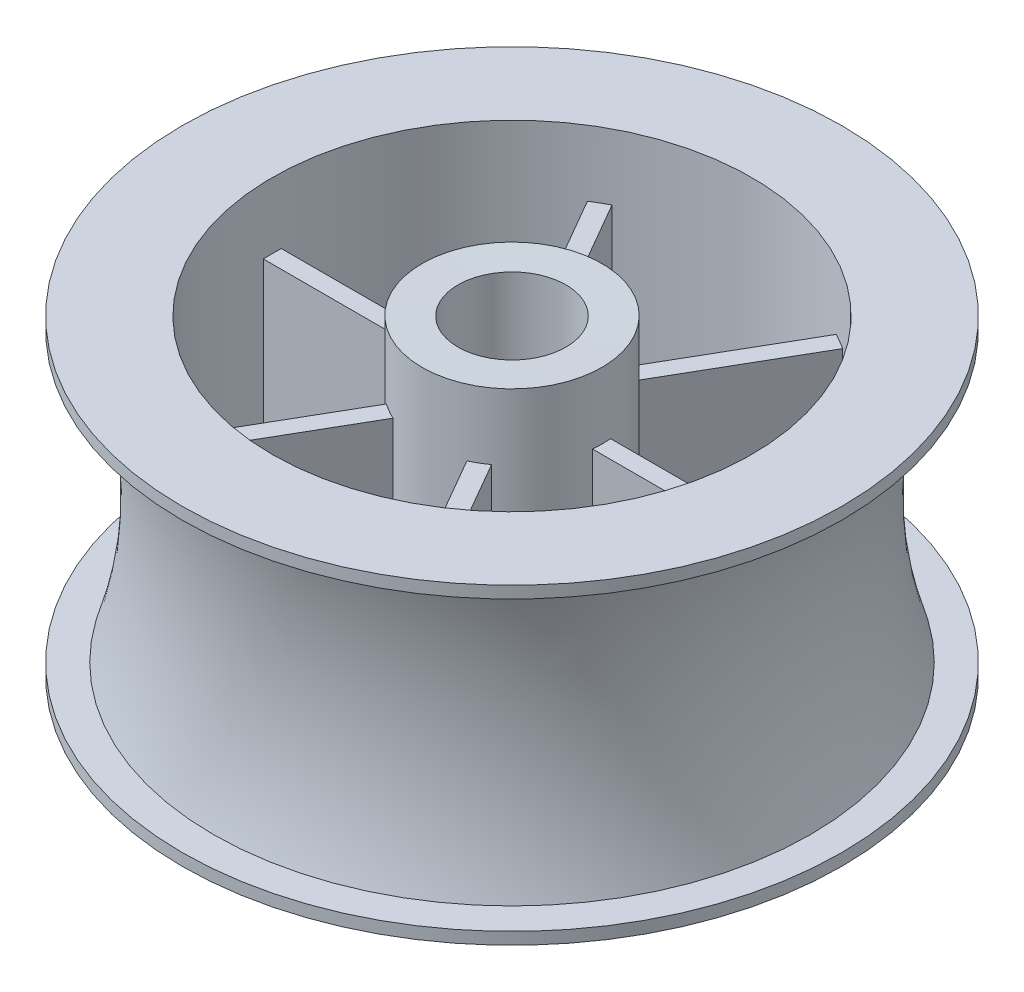
ISO-10303-21;
HEADER;
FILE_DESCRIPTION(('STEP AP214'),'2;1');
FILE_NAME('part.step','',(''),(''),'','','');
FILE_SCHEMA(('AUTOMOTIVE_DESIGN { 1 0 10303 214 1 1 1 1 }'));
ENDSEC;
DATA;
#1=APPLICATION_CONTEXT('core data for automotive mechanical design processes');
#2=APPLICATION_PROTOCOL_DEFINITION('international standard','automotive_design',2000,#1);
#3=PRODUCT_CONTEXT('',#1,'mechanical');
#4=PRODUCT('Part','Part','',(#3));
#5=PRODUCT_RELATED_PRODUCT_CATEGORY('part','',(#4));
#6=PRODUCT_DEFINITION_FORMATION('','',#4);
#7=PRODUCT_DEFINITION_CONTEXT('part definition',#1,'design');
#8=PRODUCT_DEFINITION('design','',#6,#7);
#9=PRODUCT_DEFINITION_SHAPE('','',#8);
#10=(LENGTH_UNIT() NAMED_UNIT(*) SI_UNIT(.MILLI.,.METRE.));
#11=(NAMED_UNIT(*) PLANE_ANGLE_UNIT() SI_UNIT($,.RADIAN.));
#12=(NAMED_UNIT(*) SI_UNIT($,.STERADIAN.) SOLID_ANGLE_UNIT());
#13=UNCERTAINTY_MEASURE_WITH_UNIT(LENGTH_MEASURE(1.E-05),#10,'distance_accuracy_value','');
#14=(GEOMETRIC_REPRESENTATION_CONTEXT(3) GLOBAL_UNCERTAINTY_ASSIGNED_CONTEXT((#13)) GLOBAL_UNIT_ASSIGNED_CONTEXT((#10,
#11,#12)) REPRESENTATION_CONTEXT('',''));
#15=CARTESIAN_POINT('',(0.,0.,0.));
#16=DIRECTION('',(0.,0.,1.));
#17=DIRECTION('',(1.,0.,0.));
#18=AXIS2_PLACEMENT_3D('',#15,#16,#17);
#19=CARTESIAN_POINT('',(0.,42.4047356774591,0.));
#20=DIRECTION('',(0.,1.,0.));
#21=DIRECTION('',(0.,0.,1.));
#22=AXIS2_PLACEMENT_3D('',#19,#20,#21);
#23=CYLINDRICAL_SURFACE('',#22,20.);
#24=CARTESIAN_POINT('',(0.,26.,0.));
#25=DIRECTION('',(0.,1.,0.));
#26=DIRECTION('',(0.,0.,1.));
#27=AXIS2_PLACEMENT_3D('',#24,#25,#26);
#28=CIRCLE('',#27,20.);
#29=CARTESIAN_POINT('',(0.,26.,20.));
#30=VERTEX_POINT('',#29);
#31=EDGE_CURVE('E356',#30,#30,#28,.T.);
#32=ORIENTED_EDGE('',*,*,#31,.T.);
#33=EDGE_LOOP('',(#32));
#34=FACE_BOUND('',#33,.T.);
#35=CARTESIAN_POINT('',(0.,0.,0.));
#36=DIRECTION('',(0.,1.,0.));
#37=DIRECTION('',(0.,0.,1.));
#38=AXIS2_PLACEMENT_3D('',#35,#36,#37);
#39=CIRCLE('',#38,20.);
#40=CARTESIAN_POINT('',(0.,0.,20.));
#41=VERTEX_POINT('',#40);
#42=EDGE_CURVE('E359',#41,#41,#39,.T.);
#43=ORIENTED_EDGE('',*,*,#42,.F.);
#44=EDGE_LOOP('',(#43));
#45=FACE_BOUND('',#44,.T.);
#46=DIRECTION('',(0.,1.,0.));
#47=VECTOR('',#46,1.);
#48=CARTESIAN_POINT('',(19.9859325526731,42.4047356774591,-0.75));
#49=LINE('',#48,#47);
#50=CARTESIAN_POINT('',(19.9859325526731,5.5,-0.75));
#51=VERTEX_POINT('',#50);
#52=CARTESIAN_POINT('',(19.9859325526731,20.5,-0.75));
#53=VERTEX_POINT('',#52);
#54=EDGE_CURVE('E380',#51,#53,#49,.T.);
#55=ORIENTED_EDGE('',*,*,#54,.T.);
#56=CARTESIAN_POINT('',(0.,20.5,0.));
#57=DIRECTION('',(0.,-1.,0.));
#58=DIRECTION('',(0.,0.,-1.));
#59=AXIS2_PLACEMENT_3D('',#56,#57,#58);
#60=CIRCLE('',#59,20.);
#61=CARTESIAN_POINT('',(19.9859325526731,20.5,0.75));
#62=VERTEX_POINT('',#61);
#63=EDGE_CURVE('E385',#53,#62,#60,.T.);
#64=ORIENTED_EDGE('',*,*,#63,.T.);
#65=DIRECTION('',(0.,1.,0.));
#66=VECTOR('',#65,1.);
#67=CARTESIAN_POINT('',(19.9859325526731,42.4047356774591,0.75));
#68=LINE('',#67,#66);
#69=CARTESIAN_POINT('',(19.9859325526731,5.5,0.75));
#70=VERTEX_POINT('',#69);
#71=EDGE_CURVE('E382',#62,#70,#68,.F.);
#72=ORIENTED_EDGE('',*,*,#71,.T.);
#73=CARTESIAN_POINT('',(0.,5.5,0.));
#74=DIRECTION('',(0.,-1.,0.));
#75=DIRECTION('',(0.,0.,-1.));
#76=AXIS2_PLACEMENT_3D('',#73,#74,#75);
#77=CIRCLE('',#76,20.);
#78=EDGE_CURVE('E377',#51,#70,#77,.T.);
#79=ORIENTED_EDGE('',*,*,#78,.F.);
#80=EDGE_LOOP('',(#55,#64,#72,#79));
#81=FACE_BOUND('',#80,.T.);
#82=DIRECTION('',(0.,1.,0.));
#83=VECTOR('',#82,1.);
#84=CARTESIAN_POINT('',(10.6424853291749,42.4047356774591,16.9333253089373));
#85=LINE('',#84,#83);
#86=CARTESIAN_POINT('',(10.6424853291749,5.5,16.9333253089373));
#87=VERTEX_POINT('',#86);
#88=CARTESIAN_POINT('',(10.6424853291749,20.5,16.9333253089373));
#89=VERTEX_POINT('',#88);
#90=EDGE_CURVE('E319',#87,#89,#85,.T.);
#91=ORIENTED_EDGE('',*,*,#90,.T.);
#92=CARTESIAN_POINT('',(0.,20.5,0.));
#93=DIRECTION('',(0.,-1.,0.));
#94=DIRECTION('',(0.,0.,-1.));
#95=AXIS2_PLACEMENT_3D('',#92,#93,#94);
#96=CIRCLE('',#95,20.);
#97=CARTESIAN_POINT('',(9.3434472234982,20.5,17.6833253089373));
#98=VERTEX_POINT('',#97);
#99=EDGE_CURVE('E317',#89,#98,#96,.T.);
#100=ORIENTED_EDGE('',*,*,#99,.T.);
#101=DIRECTION('',(0.,1.,0.));
#102=VECTOR('',#101,1.);
#103=CARTESIAN_POINT('',(9.3434472234982,42.4047356774591,17.6833253089373));
#104=LINE('',#103,#102);
#105=CARTESIAN_POINT('',(9.3434472234982,5.5,17.6833253089373));
#106=VERTEX_POINT('',#105);
#107=EDGE_CURVE('E321',#98,#106,#104,.F.);
#108=ORIENTED_EDGE('',*,*,#107,.T.);
#109=CARTESIAN_POINT('',(0.,5.5,0.));
#110=DIRECTION('',(0.,-1.,0.));
#111=DIRECTION('',(0.,0.,-1.));
#112=AXIS2_PLACEMENT_3D('',#109,#110,#111);
#113=CIRCLE('',#112,20.);
#114=EDGE_CURVE('E310',#87,#106,#113,.T.);
#115=ORIENTED_EDGE('',*,*,#114,.F.);
#116=EDGE_LOOP('',(#91,#100,#108,#115));
#117=FACE_BOUND('',#116,.T.);
#118=DIRECTION('',(0.,1.,0.));
#119=VECTOR('',#118,1.);
#120=CARTESIAN_POINT('',(-9.34344722349717,42.4047356774591,17.6833253089379));
#121=LINE('',#120,#119);
#122=CARTESIAN_POINT('',(-9.34344722349717,5.5,17.6833253089379));
#123=VERTEX_POINT('',#122);
#124=CARTESIAN_POINT('',(-9.34344722349717,20.5,17.6833253089379));
#125=VERTEX_POINT('',#124);
#126=EDGE_CURVE('E298',#123,#125,#121,.T.);
#127=ORIENTED_EDGE('',*,*,#126,.T.);
#128=CARTESIAN_POINT('',(0.,20.5,0.));
#129=DIRECTION('',(0.,-1.,0.));
#130=DIRECTION('',(0.,0.,-1.));
#131=AXIS2_PLACEMENT_3D('',#128,#129,#130);
#132=CIRCLE('',#131,20.);
#133=CARTESIAN_POINT('',(-10.6424853291739,20.5,16.933325308938));
#134=VERTEX_POINT('',#133);
#135=EDGE_CURVE('E296',#125,#134,#132,.T.);
#136=ORIENTED_EDGE('',*,*,#135,.T.);
#137=DIRECTION('',(0.,1.,0.));
#138=VECTOR('',#137,1.);
#139=CARTESIAN_POINT('',(-10.6424853291739,42.4047356774591,16.933325308938));
#140=LINE('',#139,#138);
#141=CARTESIAN_POINT('',(-10.6424853291739,5.5,16.933325308938));
#142=VERTEX_POINT('',#141);
#143=EDGE_CURVE('E300',#134,#142,#140,.F.);
#144=ORIENTED_EDGE('',*,*,#143,.T.);
#145=CARTESIAN_POINT('',(0.,5.5,0.));
#146=DIRECTION('',(0.,-1.,0.));
#147=DIRECTION('',(0.,0.,-1.));
#148=AXIS2_PLACEMENT_3D('',#145,#146,#147);
#149=CIRCLE('',#148,20.);
#150=EDGE_CURVE('E289',#123,#142,#149,.T.);
#151=ORIENTED_EDGE('',*,*,#150,.F.);
#152=EDGE_LOOP('',(#127,#136,#144,#151));
#153=FACE_BOUND('',#152,.T.);
#154=DIRECTION('',(0.,1.,0.));
#155=VECTOR('',#154,1.);
#156=CARTESIAN_POINT('',(-19.9859325526731,42.4047356774591,0.75000000000151));
#157=LINE('',#156,#155);
#158=CARTESIAN_POINT('',(-19.9859325526731,5.5,0.75000000000151));
#159=VERTEX_POINT('',#158);
#160=CARTESIAN_POINT('',(-19.9859325526731,20.5,0.75000000000151));
#161=VERTEX_POINT('',#160);
#162=EDGE_CURVE('E277',#159,#161,#157,.T.);
#163=ORIENTED_EDGE('',*,*,#162,.T.);
#164=CARTESIAN_POINT('',(0.,20.5,0.));
#165=DIRECTION('',(0.,-1.,0.));
#166=DIRECTION('',(0.,0.,-1.));
#167=AXIS2_PLACEMENT_3D('',#164,#165,#166);
#168=CIRCLE('',#167,20.);
#169=CARTESIAN_POINT('',(-19.9859325526732,20.5,-0.74999999999849));
#170=VERTEX_POINT('',#169);
#171=EDGE_CURVE('E275',#161,#170,#168,.T.);
#172=ORIENTED_EDGE('',*,*,#171,.T.);
#173=DIRECTION('',(0.,1.,0.));
#174=VECTOR('',#173,1.);
#175=CARTESIAN_POINT('',(-19.9859325526732,42.4047356774591,-0.74999999999849));
#176=LINE('',#175,#174);
#177=CARTESIAN_POINT('',(-19.9859325526732,5.5,-0.74999999999849));
#178=VERTEX_POINT('',#177);
#179=EDGE_CURVE('E279',#170,#178,#176,.F.);
#180=ORIENTED_EDGE('',*,*,#179,.T.);
#181=CARTESIAN_POINT('',(0.,5.5,0.));
#182=DIRECTION('',(0.,-1.,0.));
#183=DIRECTION('',(0.,0.,-1.));
#184=AXIS2_PLACEMENT_3D('',#181,#182,#183);
#185=CIRCLE('',#184,20.);
#186=EDGE_CURVE('E268',#159,#178,#185,.T.);
#187=ORIENTED_EDGE('',*,*,#186,.F.);
#188=EDGE_LOOP('',(#163,#172,#180,#187));
#189=FACE_BOUND('',#188,.T.);
#190=DIRECTION('',(0.,1.,0.));
#191=VECTOR('',#190,1.);
#192=CARTESIAN_POINT('',(-10.6424853291758,42.4047356774591,-16.9333253089367));
#193=LINE('',#192,#191);
#194=CARTESIAN_POINT('',(-10.6424853291758,5.5,-16.9333253089367));
#195=VERTEX_POINT('',#194);
#196=CARTESIAN_POINT('',(-10.6424853291758,20.5,-16.9333253089367));
#197=VERTEX_POINT('',#196);
#198=EDGE_CURVE('E256',#195,#197,#193,.T.);
#199=ORIENTED_EDGE('',*,*,#198,.T.);
#200=CARTESIAN_POINT('',(0.,20.5,0.));
#201=DIRECTION('',(0.,-1.,0.));
#202=DIRECTION('',(0.,0.,-1.));
#203=AXIS2_PLACEMENT_3D('',#200,#201,#202);
#204=CIRCLE('',#203,20.);
#205=CARTESIAN_POINT('',(-9.34344722349919,20.5,-17.6833253089368));
#206=VERTEX_POINT('',#205);
#207=EDGE_CURVE('E254',#197,#206,#204,.T.);
#208=ORIENTED_EDGE('',*,*,#207,.T.);
#209=DIRECTION('',(0.,1.,0.));
#210=VECTOR('',#209,1.);
#211=CARTESIAN_POINT('',(-9.34344722349919,42.4047356774591,-17.6833253089368));
#212=LINE('',#211,#210);
#213=CARTESIAN_POINT('',(-9.34344722349919,5.5,-17.6833253089368));
#214=VERTEX_POINT('',#213);
#215=EDGE_CURVE('E258',#206,#214,#212,.F.);
#216=ORIENTED_EDGE('',*,*,#215,.T.);
#217=CARTESIAN_POINT('',(0.,5.5,0.));
#218=DIRECTION('',(0.,-1.,0.));
#219=DIRECTION('',(0.,0.,-1.));
#220=AXIS2_PLACEMENT_3D('',#217,#218,#219);
#221=CIRCLE('',#220,20.);
#222=EDGE_CURVE('E247',#195,#214,#221,.T.);
#223=ORIENTED_EDGE('',*,*,#222,.F.);
#224=EDGE_LOOP('',(#199,#208,#216,#223));
#225=FACE_BOUND('',#224,.T.);
#226=DIRECTION('',(0.,1.,0.));
#227=VECTOR('',#226,1.);
#228=CARTESIAN_POINT('',(9.34344722349796,42.4047356774591,-17.6833253089375));
#229=LINE('',#228,#227);
#230=CARTESIAN_POINT('',(9.34344722349796,5.5,-17.6833253089375));
#231=VERTEX_POINT('',#230);
#232=CARTESIAN_POINT('',(9.34344722349796,20.5,-17.6833253089375));
#233=VERTEX_POINT('',#232);
#234=EDGE_CURVE('E66',#231,#233,#229,.T.);
#235=ORIENTED_EDGE('',*,*,#234,.T.);
#236=CARTESIAN_POINT('',(0.,20.5,0.));
#237=DIRECTION('',(0.,-1.,0.));
#238=DIRECTION('',(0.,0.,-1.));
#239=AXIS2_PLACEMENT_3D('',#236,#237,#238);
#240=CIRCLE('',#239,20.);
#241=CARTESIAN_POINT('',(10.6424853291746,20.5,-16.9333253089375));
#242=VERTEX_POINT('',#241);
#243=EDGE_CURVE('E61',#233,#242,#240,.T.);
#244=ORIENTED_EDGE('',*,*,#243,.T.);
#245=DIRECTION('',(0.,1.,0.));
#246=VECTOR('',#245,1.);
#247=CARTESIAN_POINT('',(10.6424853291746,42.4047356774591,-16.9333253089375));
#248=LINE('',#247,#246);
#249=CARTESIAN_POINT('',(10.6424853291746,5.5,-16.9333253089375));
#250=VERTEX_POINT('',#249);
#251=EDGE_CURVE('E237',#242,#250,#248,.F.);
#252=ORIENTED_EDGE('',*,*,#251,.T.);
#253=CARTESIAN_POINT('',(0.,5.5,0.));
#254=DIRECTION('',(0.,-1.,0.));
#255=DIRECTION('',(0.,0.,-1.));
#256=AXIS2_PLACEMENT_3D('',#253,#254,#255);
#257=CIRCLE('',#256,20.);
#258=EDGE_CURVE('E233',#231,#250,#257,.T.);
#259=ORIENTED_EDGE('',*,*,#258,.F.);
#260=EDGE_LOOP('',(#235,#244,#252,#259));
#261=FACE_BOUND('',#260,.T.);
#262=ADVANCED_FACE('F46',(#34,#45,#81,#117,#153,#189,#225,#261),#23,.F.);
#263=CARTESIAN_POINT('',(0.,42.4047356774591,0.));
#264=DIRECTION('',(0.,1.,0.));
#265=DIRECTION('',(0.,0.,1.));
#266=AXIS2_PLACEMENT_3D('',#263,#264,#265);
#267=CYLINDRICAL_SURFACE('',#266,7.49999999999999);
#268=CARTESIAN_POINT('',(0.,26.0370653806026,0.));
#269=DIRECTION('',(0.,1.,0.));
#270=DIRECTION('',(0.,0.,1.));
#271=AXIS2_PLACEMENT_3D('',#268,#269,#270);
#272=CIRCLE('',#271,7.49999999999999);
#273=CARTESIAN_POINT('',(0.,26.0370653806026,7.49999999999999));
#274=VERTEX_POINT('',#273);
#275=EDGE_CURVE('E323',#274,#274,#272,.T.);
#276=ORIENTED_EDGE('',*,*,#275,.F.);
#277=EDGE_LOOP('',(#276));
#278=FACE_BOUND('',#277,.T.);
#279=CARTESIAN_POINT('',(0.,0.,0.));
#280=DIRECTION('',(0.,1.,0.));
#281=DIRECTION('',(0.,0.,1.));
#282=AXIS2_PLACEMENT_3D('',#279,#280,#281);
#283=CIRCLE('',#282,7.49999999999999);
#284=CARTESIAN_POINT('',(0.,0.,7.49999999999999));
#285=VERTEX_POINT('',#284);
#286=EDGE_CURVE('E326',#285,#285,#283,.T.);
#287=ORIENTED_EDGE('',*,*,#286,.T.);
#288=EDGE_LOOP('',(#287));
#289=FACE_BOUND('',#288,.T.);
#290=DIRECTION('',(0.,1.,0.));
#291=VECTOR('',#290,1.);
#292=CARTESIAN_POINT('',(7.46240577829964,42.4047356774591,0.750000000000001));
#293=LINE('',#292,#291);
#294=CARTESIAN_POINT('',(7.46240577829964,20.5,0.750000000000001));
#295=VERTEX_POINT('',#294);
#296=CARTESIAN_POINT('',(7.46240577829964,5.5,0.750000000000001));
#297=VERTEX_POINT('',#296);
#298=EDGE_CURVE('E340',#295,#297,#293,.F.);
#299=ORIENTED_EDGE('',*,*,#298,.F.);
#300=CARTESIAN_POINT('',(0.,20.5,0.));
#301=DIRECTION('',(0.,-1.,0.));
#302=DIRECTION('',(0.,0.,-1.));
#303=AXIS2_PLACEMENT_3D('',#300,#301,#302);
#304=CIRCLE('',#303,7.49999999999999);
#305=CARTESIAN_POINT('',(7.46240577829964,20.5,-0.75));
#306=VERTEX_POINT('',#305);
#307=EDGE_CURVE('E337',#306,#295,#304,.T.);
#308=ORIENTED_EDGE('',*,*,#307,.F.);
#309=DIRECTION('',(0.,1.,0.));
#310=VECTOR('',#309,1.);
#311=CARTESIAN_POINT('',(7.46240577829964,42.4047356774591,-0.75));
#312=LINE('',#311,#310);
#313=CARTESIAN_POINT('',(7.46240577829964,5.50000000000001,-0.75));
#314=VERTEX_POINT('',#313);
#315=EDGE_CURVE('E388',#314,#306,#312,.T.);
#316=ORIENTED_EDGE('',*,*,#315,.F.);
#317=CARTESIAN_POINT('',(0.,5.5,0.));
#318=DIRECTION('',(0.,-1.,0.));
#319=DIRECTION('',(0.,0.,-1.));
#320=AXIS2_PLACEMENT_3D('',#317,#318,#319);
#321=CIRCLE('',#320,7.49999999999999);
#322=EDGE_CURVE('E335',#314,#297,#321,.T.);
#323=ORIENTED_EDGE('',*,*,#322,.T.);
#324=EDGE_LOOP('',(#299,#308,#316,#323));
#325=FACE_BOUND('',#324,.T.);
#326=DIRECTION('',(0.,1.,0.));
#327=VECTOR('',#326,1.);
#328=CARTESIAN_POINT('',(3.08168383631148,42.4047356774591,6.83763297735528));
#329=LINE('',#328,#327);
#330=CARTESIAN_POINT('',(3.08168383631148,5.5,6.83763297735528));
#331=VERTEX_POINT('',#330);
#332=CARTESIAN_POINT('',(3.08168383631148,20.5,6.83763297735528));
#333=VERTEX_POINT('',#332);
#334=EDGE_CURVE('E396',#331,#333,#329,.T.);
#335=ORIENTED_EDGE('',*,*,#334,.T.);
#336=CARTESIAN_POINT('',(0.,20.5,0.));
#337=DIRECTION('',(0.,-1.,0.));
#338=DIRECTION('',(0.,0.,-1.));
#339=AXIS2_PLACEMENT_3D('',#336,#337,#338);
#340=CIRCLE('',#339,7.49999999999999);
#341=CARTESIAN_POINT('',(4.38072194198814,20.5,6.08763297735529));
#342=VERTEX_POINT('',#341);
#343=EDGE_CURVE('E398',#333,#342,#340,.F.);
#344=ORIENTED_EDGE('',*,*,#343,.T.);
#345=DIRECTION('',(0.,1.,0.));
#346=VECTOR('',#345,1.);
#347=CARTESIAN_POINT('',(4.38072194198814,42.4047356774591,6.08763297735529));
#348=LINE('',#347,#346);
#349=CARTESIAN_POINT('',(4.38072194198814,5.5,6.08763297735529));
#350=VERTEX_POINT('',#349);
#351=EDGE_CURVE('E394',#342,#350,#348,.F.);
#352=ORIENTED_EDGE('',*,*,#351,.T.);
#353=CARTESIAN_POINT('',(0.,5.5,0.));
#354=DIRECTION('',(0.,-1.,0.));
#355=DIRECTION('',(0.,0.,-1.));
#356=AXIS2_PLACEMENT_3D('',#353,#354,#355);
#357=CIRCLE('',#356,7.49999999999999);
#358=EDGE_CURVE('E391',#331,#350,#357,.F.);
#359=ORIENTED_EDGE('',*,*,#358,.F.);
#360=EDGE_LOOP('',(#335,#344,#352,#359));
#361=FACE_BOUND('',#360,.T.);
#362=DIRECTION('',(0.,1.,0.));
#363=VECTOR('',#362,1.);
#364=CARTESIAN_POINT('',(-4.38072194198717,42.4047356774591,6.08763297735598));
#365=LINE('',#364,#363);
#366=CARTESIAN_POINT('',(-4.38072194198717,5.5,6.08763297735598));
#367=VERTEX_POINT('',#366);
#368=CARTESIAN_POINT('',(-4.38072194198717,20.5,6.08763297735598));
#369=VERTEX_POINT('',#368);
#370=EDGE_CURVE('E405',#367,#369,#365,.T.);
#371=ORIENTED_EDGE('',*,*,#370,.T.);
#372=CARTESIAN_POINT('',(0.,20.5,0.));
#373=DIRECTION('',(0.,-1.,0.));
#374=DIRECTION('',(0.,0.,-1.));
#375=AXIS2_PLACEMENT_3D('',#372,#373,#374);
#376=CIRCLE('',#375,7.49999999999999);
#377=CARTESIAN_POINT('',(-3.08168383631039,20.5,6.83763297735578));
#378=VERTEX_POINT('',#377);
#379=EDGE_CURVE('E407',#369,#378,#376,.F.);
#380=ORIENTED_EDGE('',*,*,#379,.T.);
#381=DIRECTION('',(0.,1.,0.));
#382=VECTOR('',#381,1.);
#383=CARTESIAN_POINT('',(-3.08168383631039,42.4047356774591,6.83763297735578));
#384=LINE('',#383,#382);
#385=CARTESIAN_POINT('',(-3.08168383631039,5.5,6.83763297735578));
#386=VERTEX_POINT('',#385);
#387=EDGE_CURVE('E403',#378,#386,#384,.F.);
#388=ORIENTED_EDGE('',*,*,#387,.T.);
#389=CARTESIAN_POINT('',(0.,5.5,0.));
#390=DIRECTION('',(0.,-1.,0.));
#391=DIRECTION('',(0.,0.,-1.));
#392=AXIS2_PLACEMENT_3D('',#389,#390,#391);
#393=CIRCLE('',#392,7.49999999999999);
#394=EDGE_CURVE('E400',#367,#386,#393,.F.);
#395=ORIENTED_EDGE('',*,*,#394,.F.);
#396=EDGE_LOOP('',(#371,#380,#388,#395));
#397=FACE_BOUND('',#396,.T.);
#398=DIRECTION('',(0.,1.,0.));
#399=VECTOR('',#398,1.);
#400=CARTESIAN_POINT('',(-7.46240577829979,42.4047356774591,-0.749999999998493));
#401=LINE('',#400,#399);
#402=CARTESIAN_POINT('',(-7.46240577829979,5.5,-0.749999999998493));
#403=VERTEX_POINT('',#402);
#404=CARTESIAN_POINT('',(-7.46240577829979,20.5,-0.749999999998493));
#405=VERTEX_POINT('',#404);
#406=EDGE_CURVE('E414',#403,#405,#401,.T.);
#407=ORIENTED_EDGE('',*,*,#406,.T.);
#408=CARTESIAN_POINT('',(0.,20.5,0.));
#409=DIRECTION('',(0.,-1.,0.));
#410=DIRECTION('',(0.,0.,-1.));
#411=AXIS2_PLACEMENT_3D('',#408,#409,#410);
#412=CIRCLE('',#411,7.49999999999999);
#413=CARTESIAN_POINT('',(-7.46240577829949,20.5,0.750000000001509));
#414=VERTEX_POINT('',#413);
#415=EDGE_CURVE('E416',#405,#414,#412,.F.);
#416=ORIENTED_EDGE('',*,*,#415,.T.);
#417=DIRECTION('',(0.,1.,0.));
#418=VECTOR('',#417,1.);
#419=CARTESIAN_POINT('',(-7.46240577829949,42.4047356774591,0.750000000001509));
#420=LINE('',#419,#418);
#421=CARTESIAN_POINT('',(-7.46240577829949,5.5,0.750000000001509));
#422=VERTEX_POINT('',#421);
#423=EDGE_CURVE('E412',#414,#422,#420,.F.);
#424=ORIENTED_EDGE('',*,*,#423,.T.);
#425=CARTESIAN_POINT('',(0.,5.5,0.));
#426=DIRECTION('',(0.,-1.,0.));
#427=DIRECTION('',(0.,0.,-1.));
#428=AXIS2_PLACEMENT_3D('',#425,#426,#427);
#429=CIRCLE('',#428,7.49999999999999);
#430=EDGE_CURVE('E409',#403,#422,#429,.F.);
#431=ORIENTED_EDGE('',*,*,#430,.F.);
#432=EDGE_LOOP('',(#407,#416,#424,#431));
#433=FACE_BOUND('',#432,.T.);
#434=DIRECTION('',(0.,1.,0.));
#435=VECTOR('',#434,1.);
#436=CARTESIAN_POINT('',(-3.08168383631247,42.4047356774591,-6.83763297735484));
#437=LINE('',#436,#435);
#438=CARTESIAN_POINT('',(-3.08168383631247,5.5,-6.83763297735484));
#439=VERTEX_POINT('',#438);
#440=CARTESIAN_POINT('',(-3.08168383631247,20.5,-6.83763297735484));
#441=VERTEX_POINT('',#440);
#442=EDGE_CURVE('E423',#439,#441,#437,.T.);
#443=ORIENTED_EDGE('',*,*,#442,.T.);
#444=CARTESIAN_POINT('',(0.,20.5,0.));
#445=DIRECTION('',(0.,-1.,0.));
#446=DIRECTION('',(0.,0.,-1.));
#447=AXIS2_PLACEMENT_3D('',#444,#445,#446);
#448=CIRCLE('',#447,7.49999999999999);
#449=CARTESIAN_POINT('',(-4.38072194198902,20.5,-6.08763297735465));
#450=VERTEX_POINT('',#449);
#451=EDGE_CURVE('E222',#441,#450,#448,.F.);
#452=ORIENTED_EDGE('',*,*,#451,.T.);
#453=DIRECTION('',(0.,1.,0.));
#454=VECTOR('',#453,1.);
#455=CARTESIAN_POINT('',(-4.38072194198902,42.4047356774591,-6.08763297735465));
#456=LINE('',#455,#454);
#457=CARTESIAN_POINT('',(-4.38072194198902,5.5,-6.08763297735465));
#458=VERTEX_POINT('',#457);
#459=EDGE_CURVE('E421',#450,#458,#456,.F.);
#460=ORIENTED_EDGE('',*,*,#459,.T.);
#461=CARTESIAN_POINT('',(0.,5.5,0.));
#462=DIRECTION('',(0.,-1.,0.));
#463=DIRECTION('',(0.,0.,-1.));
#464=AXIS2_PLACEMENT_3D('',#461,#462,#463);
#465=CIRCLE('',#464,7.49999999999999);
#466=EDGE_CURVE('E418',#439,#458,#465,.F.);
#467=ORIENTED_EDGE('',*,*,#466,.F.);
#468=EDGE_LOOP('',(#443,#452,#460,#467));
#469=FACE_BOUND('',#468,.T.);
#470=DIRECTION('',(0.,1.,0.));
#471=VECTOR('',#470,1.);
#472=CARTESIAN_POINT('',(4.3807219419882,42.4047356774591,-6.08763297735524));
#473=LINE('',#472,#471);
#474=CARTESIAN_POINT('',(4.3807219419882,5.5,-6.08763297735524));
#475=VERTEX_POINT('',#474);
#476=CARTESIAN_POINT('',(4.3807219419882,20.5,-6.08763297735524));
#477=VERTEX_POINT('',#476);
#478=EDGE_CURVE('E54',#475,#477,#473,.T.);
#479=ORIENTED_EDGE('',*,*,#478,.T.);
#480=CARTESIAN_POINT('',(0.,20.5,0.));
#481=DIRECTION('',(0.,-1.,0.));
#482=DIRECTION('',(0.,0.,-1.));
#483=AXIS2_PLACEMENT_3D('',#480,#481,#482);
#484=CIRCLE('',#483,7.49999999999999);
#485=CARTESIAN_POINT('',(3.08168383631121,20.5,-6.83763297735541));
#486=VERTEX_POINT('',#485);
#487=EDGE_CURVE('E13',#477,#486,#484,.F.);
#488=ORIENTED_EDGE('',*,*,#487,.T.);
#489=DIRECTION('',(0.,1.,0.));
#490=VECTOR('',#489,1.);
#491=CARTESIAN_POINT('',(3.08168383631121,42.4047356774591,-6.83763297735541));
#492=LINE('',#491,#490);
#493=CARTESIAN_POINT('',(3.08168383631121,5.5,-6.83763297735541));
#494=VERTEX_POINT('',#493);
#495=EDGE_CURVE('E203',#486,#494,#492,.F.);
#496=ORIENTED_EDGE('',*,*,#495,.T.);
#497=CARTESIAN_POINT('',(0.,5.5,0.));
#498=DIRECTION('',(0.,-1.,0.));
#499=DIRECTION('',(0.,0.,-1.));
#500=AXIS2_PLACEMENT_3D('',#497,#498,#499);
#501=CIRCLE('',#500,7.49999999999999);
#502=EDGE_CURVE('E206',#475,#494,#501,.F.);
#503=ORIENTED_EDGE('',*,*,#502,.F.);
#504=EDGE_LOOP('',(#479,#488,#496,#503));
#505=FACE_BOUND('',#504,.T.);
#506=ADVANCED_FACE('F205',(#278,#289,#325,#361,#397,#433,#469,#505),#267,.T.);
#507=CARTESIAN_POINT('',(0.,42.4047356774591,0.));
#508=DIRECTION('',(0.,1.,0.));
#509=DIRECTION('',(0.,0.,1.));
#510=AXIS2_PLACEMENT_3D('',#507,#508,#509);
#511=CYLINDRICAL_SURFACE('',#510,27.5);
#512=CARTESIAN_POINT('',(0.,25.,0.));
#513=DIRECTION('',(0.,1.,0.));
#514=DIRECTION('',(0.,0.,1.));
#515=AXIS2_PLACEMENT_3D('',#512,#513,#514);
#516=CIRCLE('',#515,27.5);
#517=CARTESIAN_POINT('',(0.,25.,27.5));
#518=VERTEX_POINT('',#517);
#519=EDGE_CURVE('E374',#518,#518,#516,.T.);
#520=ORIENTED_EDGE('',*,*,#519,.T.);
#521=EDGE_LOOP('',(#520));
#522=FACE_BOUND('',#521,.T.);
#523=CARTESIAN_POINT('',(0.,26.,0.));
#524=DIRECTION('',(0.,1.,0.));
#525=DIRECTION('',(0.,0.,1.));
#526=AXIS2_PLACEMENT_3D('',#523,#524,#525);
#527=CIRCLE('',#526,27.5);
#528=CARTESIAN_POINT('',(0.,26.,27.5));
#529=VERTEX_POINT('',#528);
#530=EDGE_CURVE('E350',#529,#529,#527,.T.);
#531=ORIENTED_EDGE('',*,*,#530,.F.);
#532=EDGE_LOOP('',(#531));
#533=FACE_BOUND('',#532,.T.);
#534=ADVANCED_FACE('F48',(#522,#533),#511,.T.);
#535=CARTESIAN_POINT('',(-27.5,25.,0.));
#536=DIRECTION('',(0.,-1.,0.));
#537=DIRECTION('',(0.,0.,-1.));
#538=AXIS2_PLACEMENT_3D('',#535,#536,#537);
#539=PLANE('',#538);
#540=CARTESIAN_POINT('',(0.,25.,0.));
#541=DIRECTION('',(0.,1.,0.));
#542=DIRECTION('',(0.,0.,1.));
#543=AXIS2_PLACEMENT_3D('',#540,#541,#542);
#544=CIRCLE('',#543,24.9);
#545=CARTESIAN_POINT('',(0.,25.,24.9));
#546=VERTEX_POINT('',#545);
#547=EDGE_CURVE('E371',#546,#546,#544,.T.);
#548=ORIENTED_EDGE('',*,*,#547,.T.);
#549=EDGE_LOOP('',(#548));
#550=FACE_BOUND('',#549,.T.);
#551=ORIENTED_EDGE('',*,*,#519,.F.);
#552=EDGE_LOOP('',(#551));
#553=FACE_BOUND('',#552,.T.);
#554=ADVANCED_FACE('F457',(#550,#553),#539,.T.);
#555=CARTESIAN_POINT('',(0.,13.,0.));
#556=DIRECTION('',(0.,1.,0.));
#557=DIRECTION('',(0.,0.,1.));
#558=AXIS2_PLACEMENT_3D('',#555,#556,#557);
#559=TOROIDAL_SURFACE('',#558,63.0575680566778,40.);
#560=CARTESIAN_POINT('',(0.,1.,0.));
#561=DIRECTION('',(0.,1.,0.));
#562=DIRECTION('',(0.,0.,1.));
#563=AXIS2_PLACEMENT_3D('',#560,#561,#562);
#564=CIRCLE('',#563,24.9);
#565=CARTESIAN_POINT('',(0.,1.,24.9));
#566=VERTEX_POINT('',#565);
#567=EDGE_CURVE('E368',#566,#566,#564,.T.);
#568=ORIENTED_EDGE('',*,*,#567,.T.);
#569=EDGE_LOOP('',(#568));
#570=FACE_BOUND('',#569,.T.);
#571=ORIENTED_EDGE('',*,*,#547,.F.);
#572=EDGE_LOOP('',(#571));
#573=FACE_BOUND('',#572,.T.);
#574=ADVANCED_FACE('F454',(#570,#573),#559,.F.);
#575=CARTESIAN_POINT('',(-24.9,1.,0.));
#576=DIRECTION('',(0.,1.,0.));
#577=DIRECTION('',(0.,0.,1.));
#578=AXIS2_PLACEMENT_3D('',#575,#576,#577);
#579=PLANE('',#578);
#580=CARTESIAN_POINT('',(0.,1.,0.));
#581=DIRECTION('',(0.,1.,0.));
#582=DIRECTION('',(0.,0.,1.));
#583=AXIS2_PLACEMENT_3D('',#580,#581,#582);
#584=CIRCLE('',#583,27.5);
#585=CARTESIAN_POINT('',(0.,1.,27.5));
#586=VERTEX_POINT('',#585);
#587=EDGE_CURVE('E365',#586,#586,#584,.T.);
#588=ORIENTED_EDGE('',*,*,#587,.T.);
#589=EDGE_LOOP('',(#588));
#590=FACE_BOUND('',#589,.T.);
#591=ORIENTED_EDGE('',*,*,#567,.F.);
#592=EDGE_LOOP('',(#591));
#593=FACE_BOUND('',#592,.T.);
#594=ADVANCED_FACE('F450',(#590,#593),#579,.T.);
#595=CARTESIAN_POINT('',(0.,42.4047356774591,0.));
#596=DIRECTION('',(0.,1.,0.));
#597=DIRECTION('',(0.,0.,1.));
#598=AXIS2_PLACEMENT_3D('',#595,#596,#597);
#599=CYLINDRICAL_SURFACE('',#598,27.5);
#600=CARTESIAN_POINT('',(0.,0.,0.));
#601=DIRECTION('',(0.,1.,0.));
#602=DIRECTION('',(0.,0.,1.));
#603=AXIS2_PLACEMENT_3D('',#600,#601,#602);
#604=CIRCLE('',#603,27.5);
#605=CARTESIAN_POINT('',(0.,0.,27.5));
#606=VERTEX_POINT('',#605);
#607=EDGE_CURVE('E362',#606,#606,#604,.T.);
#608=ORIENTED_EDGE('',*,*,#607,.T.);
#609=EDGE_LOOP('',(#608));
#610=FACE_BOUND('',#609,.T.);
#611=ORIENTED_EDGE('',*,*,#587,.F.);
#612=EDGE_LOOP('',(#611));
#613=FACE_BOUND('',#612,.T.);
#614=ADVANCED_FACE('F446',(#610,#613),#599,.T.);
#615=CARTESIAN_POINT('',(-27.5,0.,0.));
#616=DIRECTION('',(0.,-1.,0.));
#617=DIRECTION('',(0.,0.,-1.));
#618=AXIS2_PLACEMENT_3D('',#615,#616,#617);
#619=PLANE('',#618);
#620=ORIENTED_EDGE('',*,*,#42,.T.);
#621=EDGE_LOOP('',(#620));
#622=FACE_BOUND('',#621,.T.);
#623=ORIENTED_EDGE('',*,*,#607,.F.);
#624=EDGE_LOOP('',(#623));
#625=FACE_BOUND('',#624,.T.);
#626=ADVANCED_FACE('F443',(#622,#625),#619,.T.);
#627=CARTESIAN_POINT('',(-20.,26.,0.));
#628=DIRECTION('',(0.,1.,0.));
#629=DIRECTION('',(0.,0.,1.));
#630=AXIS2_PLACEMENT_3D('',#627,#628,#629);
#631=PLANE('',#630);
#632=ORIENTED_EDGE('',*,*,#530,.T.);
#633=EDGE_LOOP('',(#632));
#634=FACE_BOUND('',#633,.T.);
#635=ORIENTED_EDGE('',*,*,#31,.F.);
#636=EDGE_LOOP('',(#635));
#637=FACE_BOUND('',#636,.T.);
#638=ADVANCED_FACE('F441',(#634,#637),#631,.T.);
#639=CARTESIAN_POINT('',(0.,20.5,0.));
#640=DIRECTION('',(0.,-1.,0.));
#641=DIRECTION('',(0.,0.,-1.));
#642=AXIS2_PLACEMENT_3D('',#639,#640,#641);
#643=PLANE('',#642);
#644=DIRECTION('',(-1.,0.,0.));
#645=VECTOR('',#644,1.);
#646=CARTESIAN_POINT('',(6.83403868968979,20.5,-0.75));
#647=LINE('',#646,#645);
#648=EDGE_CURVE('E346',#53,#306,#647,.T.);
#649=ORIENTED_EDGE('',*,*,#648,.T.);
#650=ORIENTED_EDGE('',*,*,#307,.T.);
#651=DIRECTION('',(1.,0.,0.));
#652=VECTOR('',#651,1.);
#653=CARTESIAN_POINT('',(20.4487305753258,20.5,0.75));
#654=LINE('',#653,#652);
#655=EDGE_CURVE('E344',#295,#62,#654,.T.);
#656=ORIENTED_EDGE('',*,*,#655,.T.);
#657=ORIENTED_EDGE('',*,*,#63,.F.);
#658=EDGE_LOOP('',(#649,#650,#656,#657));
#659=FACE_BOUND('',#658,.T.);
#660=ADVANCED_FACE('F473',(#659),#643,.F.);
#661=CARTESIAN_POINT('',(0.,5.5,0.));
#662=DIRECTION('',(0.,-1.,0.));
#663=DIRECTION('',(0.,0.,-1.));
#664=AXIS2_PLACEMENT_3D('',#661,#662,#663);
#665=PLANE('',#664);
#666=ORIENTED_EDGE('',*,*,#322,.F.);
#667=DIRECTION('',(-1.,0.,0.));
#668=VECTOR('',#667,1.);
#669=CARTESIAN_POINT('',(6.83403868968979,5.5,-0.75));
#670=LINE('',#669,#668);
#671=EDGE_CURVE('E347',#51,#314,#670,.T.);
#672=ORIENTED_EDGE('',*,*,#671,.F.);
#673=ORIENTED_EDGE('',*,*,#78,.T.);
#674=DIRECTION('',(1.,0.,0.));
#675=VECTOR('',#674,1.);
#676=CARTESIAN_POINT('',(20.4487305753258,5.5,0.75));
#677=LINE('',#676,#675);
#678=EDGE_CURVE('E343',#297,#70,#677,.T.);
#679=ORIENTED_EDGE('',*,*,#678,.F.);
#680=EDGE_LOOP('',(#666,#672,#673,#679));
#681=FACE_BOUND('',#680,.T.);
#682=ADVANCED_FACE('F478',(#681),#665,.T.);
#683=CARTESIAN_POINT('',(20.4487305753258,20.5,0.75));
#684=DIRECTION('',(0.,0.,-1.));
#685=DIRECTION('',(-1.,0.,0.));
#686=AXIS2_PLACEMENT_3D('',#683,#684,#685);
#687=PLANE('',#686);
#688=ORIENTED_EDGE('',*,*,#655,.F.);
#689=ORIENTED_EDGE('',*,*,#298,.T.);
#690=ORIENTED_EDGE('',*,*,#678,.T.);
#691=ORIENTED_EDGE('',*,*,#71,.F.);
#692=EDGE_LOOP('',(#688,#689,#690,#691));
#693=FACE_BOUND('',#692,.T.);
#694=ADVANCED_FACE('F484',(#693),#687,.F.);
#695=CARTESIAN_POINT('',(6.83403868968979,20.5,-0.75));
#696=DIRECTION('',(0.,0.,1.));
#697=DIRECTION('',(1.,0.,0.));
#698=AXIS2_PLACEMENT_3D('',#695,#696,#697);
#699=PLANE('',#698);
#700=ORIENTED_EDGE('',*,*,#671,.T.);
#701=ORIENTED_EDGE('',*,*,#315,.T.);
#702=ORIENTED_EDGE('',*,*,#648,.F.);
#703=ORIENTED_EDGE('',*,*,#54,.F.);
#704=EDGE_LOOP('',(#700,#701,#702,#703));
#705=FACE_BOUND('',#704,.T.);
#706=ADVANCED_FACE('F491',(#705),#699,.F.);
#707=CARTESIAN_POINT('',(0.,26.,0.));
#708=DIRECTION('',(0.,1.,0.));
#709=DIRECTION('',(0.,0.,1.));
#710=AXIS2_PLACEMENT_3D('',#707,#708,#709);
#711=CONICAL_SURFACE('',#710,4.5,1.55844182853636);
#712=ORIENTED_EDGE('',*,*,#275,.T.);
#713=EDGE_LOOP('',(#712));
#714=FACE_BOUND('',#713,.T.);
#715=CARTESIAN_POINT('',(0.,26.,0.));
#716=DIRECTION('',(0.,1.,0.));
#717=DIRECTION('',(0.,0.,1.));
#718=AXIS2_PLACEMENT_3D('',#715,#716,#717);
#719=CIRCLE('',#718,4.5);
#720=CARTESIAN_POINT('',(0.,26.,4.5));
#721=VERTEX_POINT('',#720);
#722=EDGE_CURVE('E332',#721,#721,#719,.T.);
#723=ORIENTED_EDGE('',*,*,#722,.F.);
#724=EDGE_LOOP('',(#723));
#725=FACE_BOUND('',#724,.T.);
#726=ADVANCED_FACE('F488',(#714,#725),#711,.F.);
#727=CARTESIAN_POINT('',(0.,42.4047356774591,0.));
#728=DIRECTION('',(0.,1.,0.));
#729=DIRECTION('',(0.,0.,1.));
#730=AXIS2_PLACEMENT_3D('',#727,#728,#729);
#731=CYLINDRICAL_SURFACE('',#730,4.5);
#732=ORIENTED_EDGE('',*,*,#722,.T.);
#733=EDGE_LOOP('',(#732));
#734=FACE_BOUND('',#733,.T.);
#735=CARTESIAN_POINT('',(0.,0.,0.));
#736=DIRECTION('',(0.,1.,0.));
#737=DIRECTION('',(0.,0.,1.));
#738=AXIS2_PLACEMENT_3D('',#735,#736,#737);
#739=CIRCLE('',#738,4.5);
#740=CARTESIAN_POINT('',(0.,0.,4.5));
#741=VERTEX_POINT('',#740);
#742=EDGE_CURVE('E329',#741,#741,#739,.T.);
#743=ORIENTED_EDGE('',*,*,#742,.F.);
#744=EDGE_LOOP('',(#743));
#745=FACE_BOUND('',#744,.T.);
#746=ADVANCED_FACE('F598',(#734,#745),#731,.F.);
#747=CARTESIAN_POINT('',(-4.5,0.,0.));
#748=DIRECTION('',(0.,-1.,0.));
#749=DIRECTION('',(0.,0.,-1.));
#750=AXIS2_PLACEMENT_3D('',#747,#748,#749);
#751=PLANE('',#750);
#752=ORIENTED_EDGE('',*,*,#742,.T.);
#753=EDGE_LOOP('',(#752));
#754=FACE_BOUND('',#753,.T.);
#755=ORIENTED_EDGE('',*,*,#286,.F.);
#756=EDGE_LOOP('',(#755));
#757=FACE_BOUND('',#756,.T.);
#758=ADVANCED_FACE('F594',(#754,#757),#751,.T.);
#759=CARTESIAN_POINT('',(9.57484623482453,20.5,18.0841201533757));
#760=DIRECTION('',(0.86602540378444,0.,-0.499999999999998));
#761=DIRECTION('',(-0.499999999999998,0.,-0.86602540378444));
#762=AXIS2_PLACEMENT_3D('',#759,#760,#761);
#763=PLANE('',#762);
#764=ORIENTED_EDGE('',*,*,#107,.F.);
#765=DIRECTION('',(0.499999999999998,0.,0.86602540378444));
#766=VECTOR('',#765,1.);
#767=CARTESIAN_POINT('',(9.57484623482453,20.5,18.0841201533757));
#768=LINE('',#767,#766);
#769=EDGE_CURVE('E303',#333,#98,#768,.T.);
#770=ORIENTED_EDGE('',*,*,#769,.F.);
#771=ORIENTED_EDGE('',*,*,#334,.F.);
#772=DIRECTION('',(0.499999999999998,0.,0.86602540378444));
#773=VECTOR('',#772,1.);
#774=CARTESIAN_POINT('',(9.57484623482453,5.5,18.0841201533757));
#775=LINE('',#774,#773);
#776=EDGE_CURVE('E302',#331,#106,#775,.T.);
#777=ORIENTED_EDGE('',*,*,#776,.T.);
#778=EDGE_LOOP('',(#764,#770,#771,#777));
#779=FACE_BOUND('',#778,.T.);
#780=ADVANCED_FACE('F591',(#779),#763,.F.);
#781=CARTESIAN_POINT('',(4.06653839768321,20.5,5.54345111571708));
#782=DIRECTION('',(-0.86602540378444,0.,0.499999999999998));
#783=DIRECTION('',(0.499999999999998,0.,0.86602540378444));
#784=AXIS2_PLACEMENT_3D('',#781,#782,#783);
#785=PLANE('',#784);
#786=ORIENTED_EDGE('',*,*,#90,.F.);
#787=DIRECTION('',(-0.499999999999998,0.,-0.86602540378444));
#788=VECTOR('',#787,1.);
#789=CARTESIAN_POINT('',(4.06653839768321,5.5,5.54345111571708));
#790=LINE('',#789,#788);
#791=EDGE_CURVE('E307',#87,#350,#790,.T.);
#792=ORIENTED_EDGE('',*,*,#791,.T.);
#793=ORIENTED_EDGE('',*,*,#351,.F.);
#794=DIRECTION('',(-0.499999999999998,0.,-0.86602540378444));
#795=VECTOR('',#794,1.);
#796=CARTESIAN_POINT('',(4.06653839768321,20.5,5.54345111571708));
#797=LINE('',#796,#795);
#798=EDGE_CURVE('E306',#89,#342,#797,.T.);
#799=ORIENTED_EDGE('',*,*,#798,.F.);
#800=EDGE_LOOP('',(#786,#792,#793,#799));
#801=FACE_BOUND('',#800,.T.);
#802=ADVANCED_FACE('F584',(#801),#785,.F.);
#803=CARTESIAN_POINT('',(0.,20.5,0.));
#804=DIRECTION('',(0.,-1.,0.));
#805=DIRECTION('',(0.,0.,-1.));
#806=AXIS2_PLACEMENT_3D('',#803,#804,#805);
#807=PLANE('',#806);
#808=ORIENTED_EDGE('',*,*,#99,.F.);
#809=ORIENTED_EDGE('',*,*,#798,.T.);
#810=ORIENTED_EDGE('',*,*,#343,.F.);
#811=ORIENTED_EDGE('',*,*,#769,.T.);
#812=EDGE_LOOP('',(#808,#809,#810,#811));
#813=FACE_BOUND('',#812,.T.);
#814=ADVANCED_FACE('F581',(#813),#807,.F.);
#815=CARTESIAN_POINT('',(0.,5.5,0.));
#816=DIRECTION('',(0.,-1.,0.));
#817=DIRECTION('',(0.,0.,-1.));
#818=AXIS2_PLACEMENT_3D('',#815,#816,#817);
#819=PLANE('',#818);
#820=ORIENTED_EDGE('',*,*,#791,.F.);
#821=ORIENTED_EDGE('',*,*,#114,.T.);
#822=ORIENTED_EDGE('',*,*,#776,.F.);
#823=ORIENTED_EDGE('',*,*,#358,.T.);
#824=EDGE_LOOP('',(#820,#821,#822,#823));
#825=FACE_BOUND('',#824,.T.);
#826=ADVANCED_FACE('F579',(#825),#819,.T.);
#827=CARTESIAN_POINT('',(-10.8738843405004,20.5,17.3341201533768));
#828=DIRECTION('',(0.866025403784439,0.,0.5));
#829=DIRECTION('',(0.5,0.,-0.866025403784439));
#830=AXIS2_PLACEMENT_3D('',#827,#828,#829);
#831=PLANE('',#830);
#832=ORIENTED_EDGE('',*,*,#143,.F.);
#833=DIRECTION('',(-0.5,0.,0.866025403784439));
#834=VECTOR('',#833,1.);
#835=CARTESIAN_POINT('',(-10.8738843405004,20.5,17.3341201533768));
#836=LINE('',#835,#834);
#837=EDGE_CURVE('E282',#369,#134,#836,.T.);
#838=ORIENTED_EDGE('',*,*,#837,.F.);
#839=ORIENTED_EDGE('',*,*,#370,.F.);
#840=DIRECTION('',(-0.5,0.,0.866025403784439));
#841=VECTOR('',#840,1.);
#842=CARTESIAN_POINT('',(-10.8738843405004,5.5,17.3341201533768));
#843=LINE('',#842,#841);
#844=EDGE_CURVE('E281',#367,#142,#843,.T.);
#845=ORIENTED_EDGE('',*,*,#844,.T.);
#846=EDGE_LOOP('',(#832,#838,#839,#845));
#847=FACE_BOUND('',#846,.T.);
#848=ADVANCED_FACE('F575',(#847),#831,.F.);
#849=CARTESIAN_POINT('',(-2.76750029200578,20.5,6.29345111571813));
#850=DIRECTION('',(-0.866025403784439,0.,-0.5));
#851=DIRECTION('',(-0.5,0.,0.866025403784439));
#852=AXIS2_PLACEMENT_3D('',#849,#850,#851);
#853=PLANE('',#852);
#854=ORIENTED_EDGE('',*,*,#126,.F.);
#855=DIRECTION('',(0.5,0.,-0.866025403784439));
#856=VECTOR('',#855,1.);
#857=CARTESIAN_POINT('',(-2.76750029200578,5.5,6.29345111571813));
#858=LINE('',#857,#856);
#859=EDGE_CURVE('E286',#123,#386,#858,.T.);
#860=ORIENTED_EDGE('',*,*,#859,.T.);
#861=ORIENTED_EDGE('',*,*,#387,.F.);
#862=DIRECTION('',(0.5,0.,-0.866025403784439));
#863=VECTOR('',#862,1.);
#864=CARTESIAN_POINT('',(-2.76750029200578,20.5,6.29345111571813));
#865=LINE('',#864,#863);
#866=EDGE_CURVE('E285',#125,#378,#865,.T.);
#867=ORIENTED_EDGE('',*,*,#866,.F.);
#868=EDGE_LOOP('',(#854,#860,#861,#867));
#869=FACE_BOUND('',#868,.T.);
#870=ADVANCED_FACE('F568',(#869),#853,.F.);
#871=CARTESIAN_POINT('',(0.,20.5,0.));
#872=DIRECTION('',(0.,-1.,0.));
#873=DIRECTION('',(0.,0.,-1.));
#874=AXIS2_PLACEMENT_3D('',#871,#872,#873);
#875=PLANE('',#874);
#876=ORIENTED_EDGE('',*,*,#135,.F.);
#877=ORIENTED_EDGE('',*,*,#866,.T.);
#878=ORIENTED_EDGE('',*,*,#379,.F.);
#879=ORIENTED_EDGE('',*,*,#837,.T.);
#880=EDGE_LOOP('',(#876,#877,#878,#879));
#881=FACE_BOUND('',#880,.T.);
#882=ADVANCED_FACE('F565',(#881),#875,.F.);
#883=CARTESIAN_POINT('',(0.,5.5,0.));
#884=DIRECTION('',(0.,-1.,0.));
#885=DIRECTION('',(0.,0.,-1.));
#886=AXIS2_PLACEMENT_3D('',#883,#884,#885);
#887=PLANE('',#886);
#888=ORIENTED_EDGE('',*,*,#859,.F.);
#889=ORIENTED_EDGE('',*,*,#150,.T.);
#890=ORIENTED_EDGE('',*,*,#844,.F.);
#891=ORIENTED_EDGE('',*,*,#394,.T.);
#892=EDGE_LOOP('',(#888,#889,#890,#891));
#893=FACE_BOUND('',#892,.T.);
#894=ADVANCED_FACE('F563',(#893),#887,.T.);
#895=CARTESIAN_POINT('',(-20.4487305753256,20.5,-0.74999999999849));
#896=DIRECTION('',(0.,0.,1.));
#897=DIRECTION('',(1.,0.,0.));
#898=AXIS2_PLACEMENT_3D('',#895,#896,#897);
#899=PLANE('',#898);
#900=ORIENTED_EDGE('',*,*,#179,.F.);
#901=DIRECTION('',(-1.,0.,0.));
#902=VECTOR('',#901,1.);
#903=CARTESIAN_POINT('',(-20.4487305753256,20.5,-0.74999999999849));
#904=LINE('',#903,#902);
#905=EDGE_CURVE('E261',#405,#170,#904,.T.);
#906=ORIENTED_EDGE('',*,*,#905,.F.);
#907=ORIENTED_EDGE('',*,*,#406,.F.);
#908=DIRECTION('',(-1.,0.,0.));
#909=VECTOR('',#908,1.);
#910=CARTESIAN_POINT('',(-20.4487305753256,5.5,-0.74999999999849));
#911=LINE('',#910,#909);
#912=EDGE_CURVE('E260',#403,#178,#911,.T.);
#913=ORIENTED_EDGE('',*,*,#912,.T.);
#914=EDGE_LOOP('',(#900,#906,#907,#913));
#915=FACE_BOUND('',#914,.T.);
#916=ADVANCED_FACE('F559',(#915),#899,.F.);
#917=CARTESIAN_POINT('',(-6.83403868968962,20.5,0.750000000001509));
#918=DIRECTION('',(0.,0.,-1.));
#919=DIRECTION('',(-1.,0.,0.));
#920=AXIS2_PLACEMENT_3D('',#917,#918,#919);
#921=PLANE('',#920);
#922=ORIENTED_EDGE('',*,*,#162,.F.);
#923=DIRECTION('',(1.,0.,0.));
#924=VECTOR('',#923,1.);
#925=CARTESIAN_POINT('',(-6.83403868968962,5.5,0.750000000001509));
#926=LINE('',#925,#924);
#927=EDGE_CURVE('E265',#159,#422,#926,.T.);
#928=ORIENTED_EDGE('',*,*,#927,.T.);
#929=ORIENTED_EDGE('',*,*,#423,.F.);
#930=DIRECTION('',(1.,0.,0.));
#931=VECTOR('',#930,1.);
#932=CARTESIAN_POINT('',(-6.83403868968962,20.5,0.750000000001509));
#933=LINE('',#932,#931);
#934=EDGE_CURVE('E264',#161,#414,#933,.T.);
#935=ORIENTED_EDGE('',*,*,#934,.F.);
#936=EDGE_LOOP('',(#922,#928,#929,#935));
#937=FACE_BOUND('',#936,.T.);
#938=ADVANCED_FACE('F552',(#937),#921,.F.);
#939=CARTESIAN_POINT('',(0.,20.5,0.));
#940=DIRECTION('',(0.,-1.,0.));
#941=DIRECTION('',(0.,0.,-1.));
#942=AXIS2_PLACEMENT_3D('',#939,#940,#941);
#943=PLANE('',#942);
#944=ORIENTED_EDGE('',*,*,#171,.F.);
#945=ORIENTED_EDGE('',*,*,#934,.T.);
#946=ORIENTED_EDGE('',*,*,#415,.F.);
#947=ORIENTED_EDGE('',*,*,#905,.T.);
#948=EDGE_LOOP('',(#944,#945,#946,#947));
#949=FACE_BOUND('',#948,.T.);
#950=ADVANCED_FACE('F549',(#949),#943,.F.);
#951=CARTESIAN_POINT('',(0.,5.5,0.));
#952=DIRECTION('',(0.,-1.,0.));
#953=DIRECTION('',(0.,0.,-1.));
#954=AXIS2_PLACEMENT_3D('',#951,#952,#953);
#955=PLANE('',#954);
#956=ORIENTED_EDGE('',*,*,#927,.F.);
#957=ORIENTED_EDGE('',*,*,#186,.T.);
#958=ORIENTED_EDGE('',*,*,#912,.F.);
#959=ORIENTED_EDGE('',*,*,#430,.T.);
#960=EDGE_LOOP('',(#956,#957,#958,#959));
#961=FACE_BOUND('',#960,.T.);
#962=ADVANCED_FACE('F545',(#961),#955,.T.);
#963=CARTESIAN_POINT('',(-9.57484623482511,20.5,-18.0841201533745));
#964=DIRECTION('',(-0.866025403784438,0.,0.500000000000001));
#965=DIRECTION('',(0.500000000000001,0.,0.866025403784438));
#966=AXIS2_PLACEMENT_3D('',#963,#964,#965);
#967=PLANE('',#966);
#968=ORIENTED_EDGE('',*,*,#215,.F.);
#969=DIRECTION('',(-0.500000000000001,0.,-0.866025403784438));
#970=VECTOR('',#969,1.);
#971=CARTESIAN_POINT('',(-9.57484623482511,20.5,-18.0841201533745));
#972=LINE('',#971,#970);
#973=EDGE_CURVE('E240',#441,#206,#972,.T.);
#974=ORIENTED_EDGE('',*,*,#973,.F.);
#975=ORIENTED_EDGE('',*,*,#442,.F.);
#976=DIRECTION('',(-0.500000000000001,0.,-0.866025403784438));
#977=VECTOR('',#976,1.);
#978=CARTESIAN_POINT('',(-9.57484623482511,5.5,-18.0841201533745));
#979=LINE('',#978,#977);
#980=EDGE_CURVE('E239',#439,#214,#979,.T.);
#981=ORIENTED_EDGE('',*,*,#980,.T.);
#982=EDGE_LOOP('',(#968,#974,#975,#981));
#983=FACE_BOUND('',#982,.T.);
#984=ADVANCED_FACE('F530',(#983),#967,.F.);
#985=CARTESIAN_POINT('',(-4.06653839768375,20.5,-5.54345111571587));
#986=DIRECTION('',(0.866025403784438,0.,-0.5));
#987=DIRECTION('',(-0.5,0.,-0.866025403784438));
#988=AXIS2_PLACEMENT_3D('',#985,#986,#987);
#989=PLANE('',#988);
#990=ORIENTED_EDGE('',*,*,#198,.F.);
#991=DIRECTION('',(0.5,0.,0.866025403784438));
#992=VECTOR('',#991,1.);
#993=CARTESIAN_POINT('',(-4.06653839768375,5.5,-5.54345111571587));
#994=LINE('',#993,#992);
#995=EDGE_CURVE('E244',#195,#458,#994,.T.);
#996=ORIENTED_EDGE('',*,*,#995,.T.);
#997=ORIENTED_EDGE('',*,*,#459,.F.);
#998=DIRECTION('',(0.5,0.,0.866025403784438));
#999=VECTOR('',#998,1.);
#1000=CARTESIAN_POINT('',(-4.06653839768375,20.5,-5.54345111571587));
#1001=LINE('',#1000,#999);
#1002=EDGE_CURVE('E243',#197,#450,#1001,.T.);
#1003=ORIENTED_EDGE('',*,*,#1002,.F.);
#1004=EDGE_LOOP('',(#990,#996,#997,#1003));
#1005=FACE_BOUND('',#1004,.T.);
#1006=ADVANCED_FACE('F537',(#1005),#989,.F.);
#1007=CARTESIAN_POINT('',(0.,20.5,0.));
#1008=DIRECTION('',(0.,-1.,0.));
#1009=DIRECTION('',(0.,0.,-1.));
#1010=AXIS2_PLACEMENT_3D('',#1007,#1008,#1009);
#1011=PLANE('',#1010);
#1012=ORIENTED_EDGE('',*,*,#207,.F.);
#1013=ORIENTED_EDGE('',*,*,#1002,.T.);
#1014=ORIENTED_EDGE('',*,*,#451,.F.);
#1015=ORIENTED_EDGE('',*,*,#973,.T.);
#1016=EDGE_LOOP('',(#1012,#1013,#1014,#1015));
#1017=FACE_BOUND('',#1016,.T.);
#1018=ADVANCED_FACE('F527',(#1017),#1011,.F.);
#1019=CARTESIAN_POINT('',(0.,5.5,0.));
#1020=DIRECTION('',(0.,-1.,0.));
#1021=DIRECTION('',(0.,0.,-1.));
#1022=AXIS2_PLACEMENT_3D('',#1019,#1020,#1021);
#1023=PLANE('',#1022);
#1024=ORIENTED_EDGE('',*,*,#995,.F.);
#1025=ORIENTED_EDGE('',*,*,#222,.T.);
#1026=ORIENTED_EDGE('',*,*,#980,.F.);
#1027=ORIENTED_EDGE('',*,*,#466,.T.);
#1028=EDGE_LOOP('',(#1024,#1025,#1026,#1027));
#1029=FACE_BOUND('',#1028,.T.);
#1030=ADVANCED_FACE('F535',(#1029),#1023,.T.);
#1031=CARTESIAN_POINT('',(10.8738843405006,20.5,-17.3341201533753));
#1032=DIRECTION('',(-0.866025403784453,0.,-0.499999999999974));
#1033=DIRECTION('',(-0.499999999999974,0.,0.866025403784453));
#1034=AXIS2_PLACEMENT_3D('',#1031,#1032,#1033);
#1035=PLANE('',#1034);
#1036=ORIENTED_EDGE('',*,*,#251,.F.);
#1037=DIRECTION('',(0.499999999999975,0.,-0.866025403784453));
#1038=VECTOR('',#1037,1.);
#1039=CARTESIAN_POINT('',(10.8738843405006,20.5,-17.3341201533753));
#1040=LINE('',#1039,#1038);
#1041=EDGE_CURVE('E225',#477,#242,#1040,.T.);
#1042=ORIENTED_EDGE('',*,*,#1041,.F.);
#1043=ORIENTED_EDGE('',*,*,#478,.F.);
#1044=DIRECTION('',(0.499999999999975,0.,-0.866025403784453));
#1045=VECTOR('',#1044,1.);
#1046=CARTESIAN_POINT('',(10.8738843405006,5.5,-17.3341201533753));
#1047=LINE('',#1046,#1045);
#1048=EDGE_CURVE('E221',#475,#250,#1047,.T.);
#1049=ORIENTED_EDGE('',*,*,#1048,.T.);
#1050=EDGE_LOOP('',(#1036,#1042,#1043,#1049));
#1051=FACE_BOUND('',#1050,.T.);
#1052=ADVANCED_FACE('F429',(#1051),#1035,.F.);
#1053=CARTESIAN_POINT('',(2.76750029200595,20.5,-6.29345111571663));
#1054=DIRECTION('',(0.866025403784439,0.,0.499999999999999));
#1055=DIRECTION('',(0.499999999999999,0.,-0.866025403784439));
#1056=AXIS2_PLACEMENT_3D('',#1053,#1054,#1055);
#1057=PLANE('',#1056);
#1058=ORIENTED_EDGE('',*,*,#234,.F.);
#1059=DIRECTION('',(-0.499999999999999,0.,0.866025403784439));
#1060=VECTOR('',#1059,1.);
#1061=CARTESIAN_POINT('',(2.76750029200595,5.5,-6.29345111571663));
#1062=LINE('',#1061,#1060);
#1063=EDGE_CURVE('E219',#231,#494,#1062,.T.);
#1064=ORIENTED_EDGE('',*,*,#1063,.T.);
#1065=ORIENTED_EDGE('',*,*,#495,.F.);
#1066=DIRECTION('',(-0.499999999999999,0.,0.866025403784439));
#1067=VECTOR('',#1066,1.);
#1068=CARTESIAN_POINT('',(2.76750029200595,20.5,-6.29345111571663));
#1069=LINE('',#1068,#1067);
#1070=EDGE_CURVE('E228',#233,#486,#1069,.T.);
#1071=ORIENTED_EDGE('',*,*,#1070,.F.);
#1072=EDGE_LOOP('',(#1058,#1064,#1065,#1071));
#1073=FACE_BOUND('',#1072,.T.);
#1074=ADVANCED_FACE('F224',(#1073),#1057,.F.);
#1075=CARTESIAN_POINT('',(0.,20.5,0.));
#1076=DIRECTION('',(0.,-1.,0.));
#1077=DIRECTION('',(0.,0.,-1.));
#1078=AXIS2_PLACEMENT_3D('',#1075,#1076,#1077);
#1079=PLANE('',#1078);
#1080=ORIENTED_EDGE('',*,*,#243,.F.);
#1081=ORIENTED_EDGE('',*,*,#1070,.T.);
#1082=ORIENTED_EDGE('',*,*,#487,.F.);
#1083=ORIENTED_EDGE('',*,*,#1041,.T.);
#1084=EDGE_LOOP('',(#1080,#1081,#1082,#1083));
#1085=FACE_BOUND('',#1084,.T.);
#1086=ADVANCED_FACE('F428',(#1085),#1079,.F.);
#1087=CARTESIAN_POINT('',(0.,5.5,0.));
#1088=DIRECTION('',(0.,-1.,0.));
#1089=DIRECTION('',(0.,0.,-1.));
#1090=AXIS2_PLACEMENT_3D('',#1087,#1088,#1089);
#1091=PLANE('',#1090);
#1092=ORIENTED_EDGE('',*,*,#1063,.F.);
#1093=ORIENTED_EDGE('',*,*,#258,.T.);
#1094=ORIENTED_EDGE('',*,*,#1048,.F.);
#1095=ORIENTED_EDGE('',*,*,#502,.T.);
#1096=EDGE_LOOP('',(#1092,#1093,#1094,#1095));
#1097=FACE_BOUND('',#1096,.T.);
#1098=ADVANCED_FACE('F217',(#1097),#1091,.T.);
#1099=CLOSED_SHELL('',(#262,#506,#534,#554,#574,#594,#614,#626,#638,#660,#682,#694,#706,#726,
#746,#758,#780,#802,#814,#826,#848,#870,#882,#894,#916,#938,#950,#962,#984,#1006,#1018,#1030,
#1052,#1074,#1086,#1098));
#1100=MANIFOLD_SOLID_BREP('B2',#1099);
#1101=ADVANCED_BREP_SHAPE_REPRESENTATION('',(#18,#1100),#14);
#1102=SHAPE_DEFINITION_REPRESENTATION(#9,#1101);
ENDSEC;
END-ISO-10303-21;
